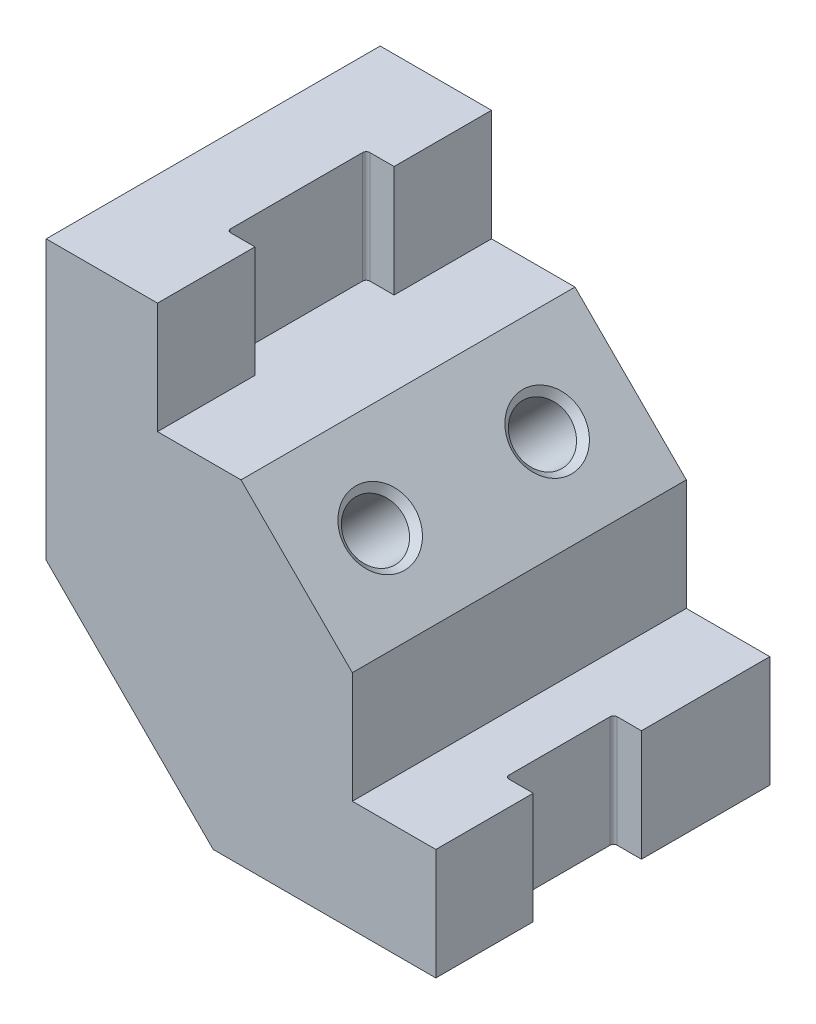
ISO-10303-21;
HEADER;
FILE_DESCRIPTION(('STEP AP214'),'2;1');
FILE_NAME('part.step','',(''),(''),'','','');
FILE_SCHEMA(('AUTOMOTIVE_DESIGN { 1 0 10303 214 1 1 1 1 }'));
ENDSEC;
DATA;
#1=APPLICATION_CONTEXT('core data for automotive mechanical design processes');
#2=APPLICATION_PROTOCOL_DEFINITION('international standard','automotive_design',2000,#1);
#3=PRODUCT_CONTEXT('',#1,'mechanical');
#4=PRODUCT('Part','Part','',(#3));
#5=PRODUCT_RELATED_PRODUCT_CATEGORY('part','',(#4));
#6=PRODUCT_DEFINITION_FORMATION('','',#4);
#7=PRODUCT_DEFINITION_CONTEXT('part definition',#1,'design');
#8=PRODUCT_DEFINITION('design','',#6,#7);
#9=PRODUCT_DEFINITION_SHAPE('','',#8);
#10=(LENGTH_UNIT() NAMED_UNIT(*) SI_UNIT(.MILLI.,.METRE.));
#11=(NAMED_UNIT(*) PLANE_ANGLE_UNIT() SI_UNIT($,.RADIAN.));
#12=(NAMED_UNIT(*) SI_UNIT($,.STERADIAN.) SOLID_ANGLE_UNIT());
#13=UNCERTAINTY_MEASURE_WITH_UNIT(LENGTH_MEASURE(1.E-05),#10,'distance_accuracy_value','');
#14=(GEOMETRIC_REPRESENTATION_CONTEXT(3) GLOBAL_UNCERTAINTY_ASSIGNED_CONTEXT((#13)) GLOBAL_UNIT_ASSIGNED_CONTEXT((#10,
#11,#12)) REPRESENTATION_CONTEXT('',''));
#15=CARTESIAN_POINT('',(0.,0.,0.));
#16=DIRECTION('',(0.,0.,1.));
#17=DIRECTION('',(1.,0.,0.));
#18=AXIS2_PLACEMENT_3D('',#15,#16,#17);
#19=CARTESIAN_POINT('',(88.9,-101.6,38.1));
#20=DIRECTION('',(-1.,0.,0.));
#21=DIRECTION('',(0.,0.,1.));
#22=AXIS2_PLACEMENT_3D('',#19,#20,#21);
#23=PLANE('',#22);
#24=DIRECTION('',(0.,0.,-1.));
#25=VECTOR('',#24,1.);
#26=CARTESIAN_POINT('',(88.9,-101.6,38.1));
#27=LINE('',#26,#25);
#28=CARTESIAN_POINT('',(88.9,-101.6,38.1));
#29=VERTEX_POINT('',#28);
#30=CARTESIAN_POINT('',(88.9,-101.6,15.875));
#31=VERTEX_POINT('',#30);
#32=EDGE_CURVE('E207',#29,#31,#27,.T.);
#33=ORIENTED_EDGE('',*,*,#32,.T.);
#34=DIRECTION('',(0.,1.,0.));
#35=VECTOR('',#34,1.);
#36=CARTESIAN_POINT('',(88.9,-101.6,15.875));
#37=LINE('',#36,#35);
#38=CARTESIAN_POINT('',(88.9,-76.2,15.875));
#39=VERTEX_POINT('',#38);
#40=EDGE_CURVE('E199',#31,#39,#37,.T.);
#41=ORIENTED_EDGE('',*,*,#40,.T.);
#42=DIRECTION('',(0.,0.,-1.));
#43=VECTOR('',#42,1.);
#44=CARTESIAN_POINT('',(88.9,-76.2,38.1));
#45=LINE('',#44,#43);
#46=CARTESIAN_POINT('',(88.9,-76.2,38.1));
#47=VERTEX_POINT('',#46);
#48=EDGE_CURVE('E208',#47,#39,#45,.T.);
#49=ORIENTED_EDGE('',*,*,#48,.F.);
#50=DIRECTION('',(0.,1.,0.));
#51=VECTOR('',#50,1.);
#52=CARTESIAN_POINT('',(88.9,-101.6,38.1));
#53=LINE('',#52,#51);
#54=EDGE_CURVE('E438',#29,#47,#53,.T.);
#55=ORIENTED_EDGE('',*,*,#54,.F.);
#56=EDGE_LOOP('',(#33,#41,#49,#55));
#57=FACE_BOUND('',#56,.T.);
#58=ADVANCED_FACE('F33',(#57),#23,.F.);
#59=CARTESIAN_POINT('',(25.4,-25.4,38.1));
#60=DIRECTION('',(-1.,0.,0.));
#61=DIRECTION('',(0.,0.,1.));
#62=AXIS2_PLACEMENT_3D('',#59,#60,#61);
#63=PLANE('',#62);
#64=DIRECTION('',(0.,0.,-1.));
#65=VECTOR('',#64,1.);
#66=CARTESIAN_POINT('',(25.4,-25.4,38.1));
#67=LINE('',#66,#65);
#68=CARTESIAN_POINT('',(25.4,-25.4,38.1));
#69=VERTEX_POINT('',#68);
#70=CARTESIAN_POINT('',(25.4,-25.4,15.875));
#71=VERTEX_POINT('',#70);
#72=EDGE_CURVE('E388',#69,#71,#67,.T.);
#73=ORIENTED_EDGE('',*,*,#72,.T.);
#74=DIRECTION('',(0.,1.,0.));
#75=VECTOR('',#74,1.);
#76=CARTESIAN_POINT('',(25.4,-25.4,15.875));
#77=LINE('',#76,#75);
#78=CARTESIAN_POINT('',(25.4,0.,15.875));
#79=VERTEX_POINT('',#78);
#80=EDGE_CURVE('E421',#71,#79,#77,.T.);
#81=ORIENTED_EDGE('',*,*,#80,.T.);
#82=DIRECTION('',(0.,0.,-1.));
#83=VECTOR('',#82,1.);
#84=CARTESIAN_POINT('',(25.4,0.,38.1));
#85=LINE('',#84,#83);
#86=CARTESIAN_POINT('',(25.4,0.,38.1));
#87=VERTEX_POINT('',#86);
#88=EDGE_CURVE('E384',#87,#79,#85,.T.);
#89=ORIENTED_EDGE('',*,*,#88,.F.);
#90=DIRECTION('',(0.,1.,0.));
#91=VECTOR('',#90,1.);
#92=CARTESIAN_POINT('',(25.4,-25.4,38.1));
#93=LINE('',#92,#91);
#94=EDGE_CURVE('E414',#69,#87,#93,.T.);
#95=ORIENTED_EDGE('',*,*,#94,.F.);
#96=EDGE_LOOP('',(#73,#81,#89,#95));
#97=FACE_BOUND('',#96,.T.);
#98=ADVANCED_FACE('F287',(#97),#63,.F.);
#99=CARTESIAN_POINT('',(0.,0.,38.1));
#100=DIRECTION('',(1.,0.,0.));
#101=DIRECTION('',(0.,1.,0.));
#102=AXIS2_PLACEMENT_3D('',#99,#100,#101);
#103=PLANE('',#102);
#104=DIRECTION('',(0.,-1.,0.));
#105=VECTOR('',#104,1.);
#106=CARTESIAN_POINT('',(0.,0.,-38.1));
#107=LINE('',#106,#105);
#108=CARTESIAN_POINT('',(0.,0.,-38.1));
#109=VERTEX_POINT('',#108);
#110=CARTESIAN_POINT('',(0.,-63.4999999999999,-38.1));
#111=VERTEX_POINT('',#110);
#112=EDGE_CURVE('E353',#109,#111,#107,.T.);
#113=ORIENTED_EDGE('',*,*,#112,.T.);
#114=DIRECTION('',(0.,0.,-1.));
#115=VECTOR('',#114,1.);
#116=CARTESIAN_POINT('',(0.,-63.4999999999999,38.1));
#117=LINE('',#116,#115);
#118=CARTESIAN_POINT('',(0.,-63.4999999999999,38.1));
#119=VERTEX_POINT('',#118);
#120=EDGE_CURVE('E217',#119,#111,#117,.T.);
#121=ORIENTED_EDGE('',*,*,#120,.F.);
#122=DIRECTION('',(0.,-1.,0.));
#123=VECTOR('',#122,1.);
#124=CARTESIAN_POINT('',(0.,0.,38.1));
#125=LINE('',#124,#123);
#126=CARTESIAN_POINT('',(0.,0.,38.1));
#127=VERTEX_POINT('',#126);
#128=EDGE_CURVE('E378',#127,#119,#125,.T.);
#129=ORIENTED_EDGE('',*,*,#128,.F.);
#130=DIRECTION('',(0.,0.,-1.));
#131=VECTOR('',#130,1.);
#132=CARTESIAN_POINT('',(0.,0.,38.1));
#133=LINE('',#132,#131);
#134=EDGE_CURVE('E379',#127,#109,#133,.T.);
#135=ORIENTED_EDGE('',*,*,#134,.T.);
#136=EDGE_LOOP('',(#113,#121,#129,#135));
#137=FACE_BOUND('',#136,.T.);
#138=ADVANCED_FACE('F293',(#137),#103,.F.);
#139=CARTESIAN_POINT('',(38.1,-101.6,38.1));
#140=DIRECTION('',(0.707106781186548,0.707106781186546,0.));
#141=DIRECTION('',(-0.707106781186547,0.707106781186549,0.));
#142=AXIS2_PLACEMENT_3D('',#139,#140,#141);
#143=PLANE('',#142);
#144=CARTESIAN_POINT('',(15.8769178448081,-79.376917844808,-19.05));
#145=DIRECTION('',(0.707106781186548,0.707106781186546,0.));
#146=DIRECTION('',(-0.707106781186547,0.707106781186549,0.));
#147=AXIS2_PLACEMENT_3D('',#144,#145,#146);
#148=CIRCLE('',#147,7.87400000000004);
#149=CARTESIAN_POINT('',(10.3091590497452,-73.8091590497451,-19.05));
#150=VERTEX_POINT('',#149);
#151=EDGE_CURVE('E257',#150,#150,#148,.T.);
#152=ORIENTED_EDGE('',*,*,#151,.T.);
#153=EDGE_LOOP('',(#152));
#154=FACE_BOUND('',#153,.T.);
#155=CARTESIAN_POINT('',(15.8769178448081,-79.376917844808,19.05));
#156=DIRECTION('',(0.707106781186548,0.707106781186546,0.));
#157=DIRECTION('',(-0.707106781186547,0.707106781186549,0.));
#158=AXIS2_PLACEMENT_3D('',#155,#156,#157);
#159=CIRCLE('',#158,7.87399999999998);
#160=CARTESIAN_POINT('',(10.3091590497453,-73.8091590497452,19.05));
#161=VERTEX_POINT('',#160);
#162=EDGE_CURVE('E254',#161,#161,#159,.T.);
#163=ORIENTED_EDGE('',*,*,#162,.T.);
#164=EDGE_LOOP('',(#163));
#165=FACE_BOUND('',#164,.T.);
#166=DIRECTION('',(0.707106781186546,-0.707106781186548,0.));
#167=VECTOR('',#166,1.);
#168=CARTESIAN_POINT('',(38.1,-101.6,-38.1));
#169=LINE('',#168,#167);
#170=CARTESIAN_POINT('',(38.1,-101.6,-38.1));
#171=VERTEX_POINT('',#170);
#172=EDGE_CURVE('E347',#111,#171,#169,.T.);
#173=ORIENTED_EDGE('',*,*,#172,.T.);
#174=DIRECTION('',(0.,0.,-1.));
#175=VECTOR('',#174,1.);
#176=CARTESIAN_POINT('',(38.1,-101.6,38.1));
#177=LINE('',#176,#175);
#178=CARTESIAN_POINT('',(38.1,-101.6,38.1));
#179=VERTEX_POINT('',#178);
#180=EDGE_CURVE('E211',#179,#171,#177,.T.);
#181=ORIENTED_EDGE('',*,*,#180,.F.);
#182=DIRECTION('',(0.707106781186546,-0.707106781186548,0.));
#183=VECTOR('',#182,1.);
#184=CARTESIAN_POINT('',(38.1,-101.6,38.1));
#185=LINE('',#184,#183);
#186=EDGE_CURVE('E435',#119,#179,#185,.T.);
#187=ORIENTED_EDGE('',*,*,#186,.F.);
#188=ORIENTED_EDGE('',*,*,#120,.T.);
#189=EDGE_LOOP('',(#173,#181,#187,#188));
#190=FACE_BOUND('',#189,.T.);
#191=ADVANCED_FACE('F307',(#154,#165,#190),#143,.F.);
#192=CARTESIAN_POINT('',(88.9,-101.6,38.1));
#193=DIRECTION('',(0.,1.,0.));
#194=DIRECTION('',(-1.,0.,0.));
#195=AXIS2_PLACEMENT_3D('',#192,#193,#194);
#196=PLANE('',#195);
#197=DIRECTION('',(-1.,0.,0.));
#198=VECTOR('',#197,1.);
#199=CARTESIAN_POINT('',(88.9,-101.6,-8.80841828335953));
#200=LINE('',#199,#198);
#201=CARTESIAN_POINT('',(88.9,-101.6,-8.80841828335953));
#202=VERTEX_POINT('',#201);
#203=CARTESIAN_POINT('',(83.3628,-101.6,-8.80841828335954));
#204=VERTEX_POINT('',#203);
#205=EDGE_CURVE('E181',#202,#204,#200,.T.);
#206=ORIENTED_EDGE('',*,*,#205,.T.);
#207=CARTESIAN_POINT('',(83.3628,-101.6,-7.99561828335954));
#208=DIRECTION('',(0.,1.,0.));
#209=DIRECTION('',(-1.,0.,0.));
#210=AXIS2_PLACEMENT_3D('',#207,#208,#209);
#211=CIRCLE('',#210,0.8128);
#212=CARTESIAN_POINT('',(82.55,-101.6,-7.99561828335954));
#213=VERTEX_POINT('',#212);
#214=EDGE_CURVE('E251',#204,#213,#211,.T.);
#215=ORIENTED_EDGE('',*,*,#214,.T.);
#216=DIRECTION('',(0.,0.,1.));
#217=VECTOR('',#216,1.);
#218=CARTESIAN_POINT('',(82.55,-101.6,15.875));
#219=LINE('',#218,#217);
#220=CARTESIAN_POINT('',(82.55,-101.6,15.0622));
#221=VERTEX_POINT('',#220);
#222=EDGE_CURVE('E189',#213,#221,#219,.T.);
#223=ORIENTED_EDGE('',*,*,#222,.T.);
#224=CARTESIAN_POINT('',(83.3628,-101.6,15.0622));
#225=DIRECTION('',(0.,1.,0.));
#226=DIRECTION('',(-1.,0.,0.));
#227=AXIS2_PLACEMENT_3D('',#224,#225,#226);
#228=CIRCLE('',#227,0.8128);
#229=CARTESIAN_POINT('',(83.3628,-101.6,15.875));
#230=VERTEX_POINT('',#229);
#231=EDGE_CURVE('E245',#221,#230,#228,.T.);
#232=ORIENTED_EDGE('',*,*,#231,.T.);
#233=DIRECTION('',(1.,0.,0.));
#234=VECTOR('',#233,1.);
#235=CARTESIAN_POINT('',(88.9,-101.6,15.875));
#236=LINE('',#235,#234);
#237=EDGE_CURVE('E200',#230,#31,#236,.T.);
#238=ORIENTED_EDGE('',*,*,#237,.T.);
#239=ORIENTED_EDGE('',*,*,#32,.F.);
#240=DIRECTION('',(1.,0.,0.));
#241=VECTOR('',#240,1.);
#242=CARTESIAN_POINT('',(88.9,-101.6,38.1));
#243=LINE('',#242,#241);
#244=EDGE_CURVE('E356',#179,#29,#243,.T.);
#245=ORIENTED_EDGE('',*,*,#244,.F.);
#246=ORIENTED_EDGE('',*,*,#180,.T.);
#247=DIRECTION('',(1.,0.,0.));
#248=VECTOR('',#247,1.);
#249=CARTESIAN_POINT('',(88.9,-101.6,-38.1));
#250=LINE('',#249,#248);
#251=CARTESIAN_POINT('',(88.9,-101.6,-38.1));
#252=VERTEX_POINT('',#251);
#253=EDGE_CURVE('E205',#171,#252,#250,.T.);
#254=ORIENTED_EDGE('',*,*,#253,.T.);
#255=EDGE_CURVE('E196',#202,#252,#27,.T.);
#256=ORIENTED_EDGE('',*,*,#255,.F.);
#257=EDGE_LOOP('',(#206,#215,#223,#232,#238,#239,#245,#246,#254,#256));
#258=FACE_BOUND('',#257,.T.);
#259=ADVANCED_FACE('F202',(#258),#196,.F.);
#260=CARTESIAN_POINT('',(88.9,-76.2,-8.80841828335952));
#261=VERTEX_POINT('',#260);
#262=CARTESIAN_POINT('',(88.9,-76.2,-38.1));
#263=VERTEX_POINT('',#262);
#264=EDGE_CURVE('E198',#261,#263,#45,.T.);
#265=ORIENTED_EDGE('',*,*,#264,.F.);
#266=DIRECTION('',(0.,1.,0.));
#267=VECTOR('',#266,1.);
#268=CARTESIAN_POINT('',(88.9,-101.6,-8.80841828335953));
#269=LINE('',#268,#267);
#270=EDGE_CURVE('E184',#202,#261,#269,.T.);
#271=ORIENTED_EDGE('',*,*,#270,.F.);
#272=ORIENTED_EDGE('',*,*,#255,.T.);
#273=DIRECTION('',(0.,1.,0.));
#274=VECTOR('',#273,1.);
#275=CARTESIAN_POINT('',(88.9,-101.6,-38.1));
#276=LINE('',#275,#274);
#277=EDGE_CURVE('E359',#252,#263,#276,.T.);
#278=ORIENTED_EDGE('',*,*,#277,.T.);
#279=EDGE_LOOP('',(#265,#271,#272,#278));
#280=FACE_BOUND('',#279,.T.);
#281=ADVANCED_FACE('F194',(#280),#23,.F.);
#282=CARTESIAN_POINT('',(88.9,-76.2,38.1));
#283=DIRECTION('',(0.,-1.,0.));
#284=DIRECTION('',(1.,0.,0.));
#285=AXIS2_PLACEMENT_3D('',#282,#283,#284);
#286=PLANE('',#285);
#287=ORIENTED_EDGE('',*,*,#48,.T.);
#288=DIRECTION('',(1.,0.,0.));
#289=VECTOR('',#288,1.);
#290=CARTESIAN_POINT('',(88.9,-76.2,15.875));
#291=LINE('',#290,#289);
#292=CARTESIAN_POINT('',(83.3628,-76.2,15.875));
#293=VERTEX_POINT('',#292);
#294=EDGE_CURVE('E190',#293,#39,#291,.T.);
#295=ORIENTED_EDGE('',*,*,#294,.F.);
#296=CARTESIAN_POINT('',(83.3628,-76.2,15.0622));
#297=DIRECTION('',(0.,-1.,0.));
#298=DIRECTION('',(1.,0.,0.));
#299=AXIS2_PLACEMENT_3D('',#296,#297,#298);
#300=CIRCLE('',#299,0.8128);
#301=CARTESIAN_POINT('',(82.55,-76.2,15.0622));
#302=VERTEX_POINT('',#301);
#303=EDGE_CURVE('E243',#293,#302,#300,.T.);
#304=ORIENTED_EDGE('',*,*,#303,.T.);
#305=DIRECTION('',(0.,0.,1.));
#306=VECTOR('',#305,1.);
#307=CARTESIAN_POINT('',(82.55,-76.2,15.875));
#308=LINE('',#307,#306);
#309=CARTESIAN_POINT('',(82.55,-76.2,-7.99561828335954));
#310=VERTEX_POINT('',#309);
#311=EDGE_CURVE('E497',#310,#302,#308,.T.);
#312=ORIENTED_EDGE('',*,*,#311,.F.);
#313=CARTESIAN_POINT('',(83.3628,-76.2,-7.99561828335954));
#314=DIRECTION('',(0.,-1.,0.));
#315=DIRECTION('',(1.,0.,0.));
#316=AXIS2_PLACEMENT_3D('',#313,#314,#315);
#317=CIRCLE('',#316,0.8128);
#318=CARTESIAN_POINT('',(83.3628,-76.2,-8.80841828335954));
#319=VERTEX_POINT('',#318);
#320=EDGE_CURVE('E249',#310,#319,#317,.T.);
#321=ORIENTED_EDGE('',*,*,#320,.T.);
#322=DIRECTION('',(-1.,0.,0.));
#323=VECTOR('',#322,1.);
#324=CARTESIAN_POINT('',(88.9,-76.2,-8.80841828335953));
#325=LINE('',#324,#323);
#326=EDGE_CURVE('E402',#261,#319,#325,.T.);
#327=ORIENTED_EDGE('',*,*,#326,.F.);
#328=ORIENTED_EDGE('',*,*,#264,.T.);
#329=DIRECTION('',(-1.,0.,0.));
#330=VECTOR('',#329,1.);
#331=CARTESIAN_POINT('',(88.9,-76.2,-38.1));
#332=LINE('',#331,#330);
#333=CARTESIAN_POINT('',(69.8499999999999,-76.2,-38.1));
#334=VERTEX_POINT('',#333);
#335=EDGE_CURVE('E361',#263,#334,#332,.T.);
#336=ORIENTED_EDGE('',*,*,#335,.T.);
#337=DIRECTION('',(0.,0.,-1.));
#338=VECTOR('',#337,1.);
#339=CARTESIAN_POINT('',(69.8499999999999,-76.2,38.1));
#340=LINE('',#339,#338);
#341=CARTESIAN_POINT('',(69.8499999999999,-76.2,38.1));
#342=VERTEX_POINT('',#341);
#343=EDGE_CURVE('E396',#342,#334,#340,.T.);
#344=ORIENTED_EDGE('',*,*,#343,.F.);
#345=DIRECTION('',(-1.,0.,0.));
#346=VECTOR('',#345,1.);
#347=CARTESIAN_POINT('',(88.9,-76.2,38.1));
#348=LINE('',#347,#346);
#349=EDGE_CURVE('E416',#47,#342,#348,.T.);
#350=ORIENTED_EDGE('',*,*,#349,.F.);
#351=EDGE_LOOP('',(#287,#295,#304,#312,#321,#327,#328,#336,#344,#350));
#352=FACE_BOUND('',#351,.T.);
#353=ADVANCED_FACE('F300',(#352),#286,.F.);
#354=CARTESIAN_POINT('',(69.8499999999999,-76.2,38.1));
#355=DIRECTION('',(-1.,0.,0.));
#356=DIRECTION('',(0.,0.,1.));
#357=AXIS2_PLACEMENT_3D('',#354,#355,#356);
#358=PLANE('',#357);
#359=DIRECTION('',(0.,1.,0.));
#360=VECTOR('',#359,1.);
#361=CARTESIAN_POINT('',(69.8499999999999,-76.2,-38.1));
#362=LINE('',#361,#360);
#363=CARTESIAN_POINT('',(69.8499999999999,-50.8,-38.1));
#364=VERTEX_POINT('',#363);
#365=EDGE_CURVE('E366',#334,#364,#362,.T.);
#366=ORIENTED_EDGE('',*,*,#365,.T.);
#367=DIRECTION('',(0.,0.,-1.));
#368=VECTOR('',#367,1.);
#369=CARTESIAN_POINT('',(69.8499999999999,-50.8,38.1));
#370=LINE('',#369,#368);
#371=CARTESIAN_POINT('',(69.8499999999999,-50.8,38.1));
#372=VERTEX_POINT('',#371);
#373=EDGE_CURVE('E394',#372,#364,#370,.T.);
#374=ORIENTED_EDGE('',*,*,#373,.F.);
#375=DIRECTION('',(0.,1.,0.));
#376=VECTOR('',#375,1.);
#377=CARTESIAN_POINT('',(69.8499999999999,-76.2,38.1));
#378=LINE('',#377,#376);
#379=EDGE_CURVE('E412',#342,#372,#378,.T.);
#380=ORIENTED_EDGE('',*,*,#379,.F.);
#381=ORIENTED_EDGE('',*,*,#343,.T.);
#382=EDGE_LOOP('',(#366,#374,#380,#381));
#383=FACE_BOUND('',#382,.T.);
#384=ADVANCED_FACE('F305',(#383),#358,.F.);
#385=CARTESIAN_POINT('',(69.8499999999999,-50.8,38.1));
#386=DIRECTION('',(-0.707106781186548,-0.707106781186547,0.));
#387=DIRECTION('',(0.707106781186547,-0.707106781186548,0.));
#388=AXIS2_PLACEMENT_3D('',#385,#386,#387);
#389=PLANE('',#388);
#390=CARTESIAN_POINT('',(57.1519178448081,-38.1019178448082,-19.05));
#391=DIRECTION('',(-0.707106781186548,-0.707106781186547,0.));
#392=DIRECTION('',(0.707106781186547,-0.707106781186548,0.));
#393=AXIS2_PLACEMENT_3D('',#390,#391,#392);
#394=CIRCLE('',#393,7.87399999999999);
#395=CARTESIAN_POINT('',(62.719676639871,-43.669676639871,-19.05));
#396=VERTEX_POINT('',#395);
#397=EDGE_CURVE('E11',#396,#396,#394,.T.);
#398=ORIENTED_EDGE('',*,*,#397,.T.);
#399=EDGE_LOOP('',(#398));
#400=FACE_BOUND('',#399,.T.);
#401=CARTESIAN_POINT('',(57.1519178448081,-38.1019178448082,19.05));
#402=DIRECTION('',(-0.707106781186548,-0.707106781186547,0.));
#403=DIRECTION('',(0.707106781186547,-0.707106781186548,0.));
#404=AXIS2_PLACEMENT_3D('',#401,#402,#403);
#405=CIRCLE('',#404,7.87399999999997);
#406=CARTESIAN_POINT('',(62.719676639871,-43.669676639871,19.05));
#407=VERTEX_POINT('',#406);
#408=EDGE_CURVE('E41',#407,#407,#405,.T.);
#409=ORIENTED_EDGE('',*,*,#408,.T.);
#410=EDGE_LOOP('',(#409));
#411=FACE_BOUND('',#410,.T.);
#412=DIRECTION('',(-0.707106781186547,0.707106781186548,0.));
#413=VECTOR('',#412,1.);
#414=CARTESIAN_POINT('',(69.8499999999999,-50.8,-38.1));
#415=LINE('',#414,#413);
#416=CARTESIAN_POINT('',(44.45,-25.4,-38.1));
#417=VERTEX_POINT('',#416);
#418=EDGE_CURVE('E368',#364,#417,#415,.T.);
#419=ORIENTED_EDGE('',*,*,#418,.T.);
#420=DIRECTION('',(0.,0.,-1.));
#421=VECTOR('',#420,1.);
#422=CARTESIAN_POINT('',(44.45,-25.4,38.1));
#423=LINE('',#422,#421);
#424=CARTESIAN_POINT('',(44.45,-25.4,38.1));
#425=VERTEX_POINT('',#424);
#426=EDGE_CURVE('E391',#425,#417,#423,.T.);
#427=ORIENTED_EDGE('',*,*,#426,.F.);
#428=DIRECTION('',(-0.707106781186547,0.707106781186548,0.));
#429=VECTOR('',#428,1.);
#430=CARTESIAN_POINT('',(69.8499999999999,-50.8,38.1));
#431=LINE('',#430,#429);
#432=EDGE_CURVE('E408',#372,#425,#431,.T.);
#433=ORIENTED_EDGE('',*,*,#432,.F.);
#434=ORIENTED_EDGE('',*,*,#373,.T.);
#435=EDGE_LOOP('',(#419,#427,#433,#434));
#436=FACE_BOUND('',#435,.T.);
#437=ADVANCED_FACE('F274',(#400,#411,#436),#389,.F.);
#438=CARTESIAN_POINT('',(44.45,-25.4,38.1));
#439=DIRECTION('',(0.,-1.,0.));
#440=DIRECTION('',(1.,0.,0.));
#441=AXIS2_PLACEMENT_3D('',#438,#439,#440);
#442=PLANE('',#441);
#443=DIRECTION('',(0.,0.,1.));
#444=VECTOR('',#443,1.);
#445=CARTESIAN_POINT('',(19.05,-25.4,15.875));
#446=LINE('',#445,#444);
#447=CARTESIAN_POINT('',(19.05,-25.4,-15.0622));
#448=VERTEX_POINT('',#447);
#449=CARTESIAN_POINT('',(19.05,-25.4,15.0622));
#450=VERTEX_POINT('',#449);
#451=EDGE_CURVE('E458',#448,#450,#446,.T.);
#452=ORIENTED_EDGE('',*,*,#451,.T.);
#453=CARTESIAN_POINT('',(19.8628,-25.4,15.0622));
#454=DIRECTION('',(0.,-1.,0.));
#455=DIRECTION('',(1.,0.,0.));
#456=AXIS2_PLACEMENT_3D('',#453,#454,#455);
#457=CIRCLE('',#456,0.8128);
#458=CARTESIAN_POINT('',(19.8628,-25.4,15.875));
#459=VERTEX_POINT('',#458);
#460=EDGE_CURVE('E238',#450,#459,#457,.F.);
#461=ORIENTED_EDGE('',*,*,#460,.T.);
#462=DIRECTION('',(1.,0.,0.));
#463=VECTOR('',#462,1.);
#464=CARTESIAN_POINT('',(25.4,-25.4,15.875));
#465=LINE('',#464,#463);
#466=EDGE_CURVE('E427',#459,#71,#465,.T.);
#467=ORIENTED_EDGE('',*,*,#466,.T.);
#468=ORIENTED_EDGE('',*,*,#72,.F.);
#469=DIRECTION('',(-1.,0.,0.));
#470=VECTOR('',#469,1.);
#471=CARTESIAN_POINT('',(44.45,-25.4,38.1));
#472=LINE('',#471,#470);
#473=EDGE_CURVE('E411',#425,#69,#472,.T.);
#474=ORIENTED_EDGE('',*,*,#473,.F.);
#475=ORIENTED_EDGE('',*,*,#426,.T.);
#476=DIRECTION('',(-1.,0.,0.));
#477=VECTOR('',#476,1.);
#478=CARTESIAN_POINT('',(44.45,-25.4,-38.1));
#479=LINE('',#478,#477);
#480=CARTESIAN_POINT('',(25.4,-25.4,-38.1));
#481=VERTEX_POINT('',#480);
#482=EDGE_CURVE('E370',#417,#481,#479,.T.);
#483=ORIENTED_EDGE('',*,*,#482,.T.);
#484=CARTESIAN_POINT('',(25.4,-25.4,-15.875));
#485=VERTEX_POINT('',#484);
#486=EDGE_CURVE('E387',#485,#481,#67,.T.);
#487=ORIENTED_EDGE('',*,*,#486,.F.);
#488=DIRECTION('',(-1.,0.,0.));
#489=VECTOR('',#488,1.);
#490=CARTESIAN_POINT('',(25.4,-25.4,-15.875));
#491=LINE('',#490,#489);
#492=CARTESIAN_POINT('',(19.8628,-25.4,-15.875));
#493=VERTEX_POINT('',#492);
#494=EDGE_CURVE('E455',#485,#493,#491,.T.);
#495=ORIENTED_EDGE('',*,*,#494,.T.);
#496=CARTESIAN_POINT('',(19.8628,-25.4,-15.0622));
#497=DIRECTION('',(0.,-1.,0.));
#498=DIRECTION('',(1.,0.,0.));
#499=AXIS2_PLACEMENT_3D('',#496,#497,#498);
#500=CIRCLE('',#499,0.8128);
#501=EDGE_CURVE('E236',#493,#448,#500,.F.);
#502=ORIENTED_EDGE('',*,*,#501,.T.);
#503=EDGE_LOOP('',(#452,#461,#467,#468,#474,#475,#483,#487,#495,#502));
#504=FACE_BOUND('',#503,.T.);
#505=ADVANCED_FACE('F475',(#504),#442,.F.);
#506=CARTESIAN_POINT('',(25.4,0.,-15.875));
#507=VERTEX_POINT('',#506);
#508=CARTESIAN_POINT('',(25.4,0.,-38.1));
#509=VERTEX_POINT('',#508);
#510=EDGE_CURVE('E382',#507,#509,#85,.T.);
#511=ORIENTED_EDGE('',*,*,#510,.F.);
#512=DIRECTION('',(0.,1.,0.));
#513=VECTOR('',#512,1.);
#514=CARTESIAN_POINT('',(25.4,-25.4,-15.875));
#515=LINE('',#514,#513);
#516=EDGE_CURVE('E423',#485,#507,#515,.T.);
#517=ORIENTED_EDGE('',*,*,#516,.F.);
#518=ORIENTED_EDGE('',*,*,#486,.T.);
#519=DIRECTION('',(0.,1.,0.));
#520=VECTOR('',#519,1.);
#521=CARTESIAN_POINT('',(25.4,-25.4,-38.1));
#522=LINE('',#521,#520);
#523=EDGE_CURVE('E373',#481,#509,#522,.T.);
#524=ORIENTED_EDGE('',*,*,#523,.T.);
#525=EDGE_LOOP('',(#511,#517,#518,#524));
#526=FACE_BOUND('',#525,.T.);
#527=ADVANCED_FACE('F296',(#526),#63,.F.);
#528=CARTESIAN_POINT('',(25.4,0.,38.1));
#529=DIRECTION('',(0.,-1.,0.));
#530=DIRECTION('',(0.,0.,-1.));
#531=AXIS2_PLACEMENT_3D('',#528,#529,#530);
#532=PLANE('',#531);
#533=ORIENTED_EDGE('',*,*,#88,.T.);
#534=DIRECTION('',(1.,0.,0.));
#535=VECTOR('',#534,1.);
#536=CARTESIAN_POINT('',(25.4,0.,15.875));
#537=LINE('',#536,#535);
#538=CARTESIAN_POINT('',(19.8628,0.,15.875));
#539=VERTEX_POINT('',#538);
#540=EDGE_CURVE('E430',#539,#79,#537,.T.);
#541=ORIENTED_EDGE('',*,*,#540,.F.);
#542=CARTESIAN_POINT('',(19.8628,0.,15.0622));
#543=DIRECTION('',(0.,-1.,0.));
#544=DIRECTION('',(0.,0.,-1.));
#545=AXIS2_PLACEMENT_3D('',#542,#543,#544);
#546=CIRCLE('',#545,0.8128);
#547=CARTESIAN_POINT('',(19.05,0.,15.0622));
#548=VERTEX_POINT('',#547);
#549=EDGE_CURVE('E247',#539,#548,#546,.T.);
#550=ORIENTED_EDGE('',*,*,#549,.T.);
#551=DIRECTION('',(0.,0.,1.));
#552=VECTOR('',#551,1.);
#553=CARTESIAN_POINT('',(19.05,0.,15.875));
#554=LINE('',#553,#552);
#555=CARTESIAN_POINT('',(19.05,0.,-15.0622));
#556=VERTEX_POINT('',#555);
#557=EDGE_CURVE('E450',#556,#548,#554,.T.);
#558=ORIENTED_EDGE('',*,*,#557,.F.);
#559=CARTESIAN_POINT('',(19.8628,0.,-15.0622));
#560=DIRECTION('',(0.,-1.,0.));
#561=DIRECTION('',(0.,0.,-1.));
#562=AXIS2_PLACEMENT_3D('',#559,#560,#561);
#563=CIRCLE('',#562,0.8128);
#564=CARTESIAN_POINT('',(19.8628,0.,-15.875));
#565=VERTEX_POINT('',#564);
#566=EDGE_CURVE('E48',#556,#565,#563,.T.);
#567=ORIENTED_EDGE('',*,*,#566,.T.);
#568=DIRECTION('',(-1.,0.,0.));
#569=VECTOR('',#568,1.);
#570=CARTESIAN_POINT('',(25.4,0.,-15.875));
#571=LINE('',#570,#569);
#572=EDGE_CURVE('E448',#507,#565,#571,.T.);
#573=ORIENTED_EDGE('',*,*,#572,.F.);
#574=ORIENTED_EDGE('',*,*,#510,.T.);
#575=DIRECTION('',(-1.,0.,0.));
#576=VECTOR('',#575,1.);
#577=CARTESIAN_POINT('',(25.4,0.,-38.1));
#578=LINE('',#577,#576);
#579=EDGE_CURVE('E376',#509,#109,#578,.T.);
#580=ORIENTED_EDGE('',*,*,#579,.T.);
#581=ORIENTED_EDGE('',*,*,#134,.F.);
#582=DIRECTION('',(-1.,0.,0.));
#583=VECTOR('',#582,1.);
#584=CARTESIAN_POINT('',(25.4,0.,38.1));
#585=LINE('',#584,#583);
#586=EDGE_CURVE('E383',#87,#127,#585,.T.);
#587=ORIENTED_EDGE('',*,*,#586,.F.);
#588=EDGE_LOOP('',(#533,#541,#550,#558,#567,#573,#574,#580,#581,#587));
#589=FACE_BOUND('',#588,.T.);
#590=ADVANCED_FACE('F469',(#589),#532,.F.);
#591=CARTESIAN_POINT('',(0.,0.,38.1));
#592=DIRECTION('',(0.,0.,-1.));
#593=DIRECTION('',(-1.,0.,0.));
#594=AXIS2_PLACEMENT_3D('',#591,#592,#593);
#595=PLANE('',#594);
#596=ORIENTED_EDGE('',*,*,#128,.T.);
#597=ORIENTED_EDGE('',*,*,#186,.T.);
#598=ORIENTED_EDGE('',*,*,#244,.T.);
#599=ORIENTED_EDGE('',*,*,#54,.T.);
#600=ORIENTED_EDGE('',*,*,#349,.T.);
#601=ORIENTED_EDGE('',*,*,#379,.T.);
#602=ORIENTED_EDGE('',*,*,#432,.T.);
#603=ORIENTED_EDGE('',*,*,#473,.T.);
#604=ORIENTED_EDGE('',*,*,#94,.T.);
#605=ORIENTED_EDGE('',*,*,#586,.T.);
#606=EDGE_LOOP('',(#596,#597,#598,#599,#600,#601,#602,#603,#604,#605));
#607=FACE_BOUND('',#606,.T.);
#608=ADVANCED_FACE('F440',(#607),#595,.F.);
#609=CARTESIAN_POINT('',(0.,0.,-38.1));
#610=DIRECTION('',(0.,0.,-1.));
#611=DIRECTION('',(-1.,0.,0.));
#612=AXIS2_PLACEMENT_3D('',#609,#610,#611);
#613=PLANE('',#612);
#614=ORIENTED_EDGE('',*,*,#112,.F.);
#615=ORIENTED_EDGE('',*,*,#579,.F.);
#616=ORIENTED_EDGE('',*,*,#523,.F.);
#617=ORIENTED_EDGE('',*,*,#482,.F.);
#618=ORIENTED_EDGE('',*,*,#418,.F.);
#619=ORIENTED_EDGE('',*,*,#365,.F.);
#620=ORIENTED_EDGE('',*,*,#335,.F.);
#621=ORIENTED_EDGE('',*,*,#277,.F.);
#622=ORIENTED_EDGE('',*,*,#253,.F.);
#623=ORIENTED_EDGE('',*,*,#172,.F.);
#624=EDGE_LOOP('',(#614,#615,#616,#617,#618,#619,#620,#621,#622,#623));
#625=FACE_BOUND('',#624,.T.);
#626=ADVANCED_FACE('F357',(#625),#613,.T.);
#627=CARTESIAN_POINT('',(-3.17308215519192,-98.4269178448081,19.05));
#628=DIRECTION('',(0.707106781186548,0.707106781186546,0.));
#629=DIRECTION('',(-0.707106781186547,0.707106781186549,0.));
#630=AXIS2_PLACEMENT_3D('',#627,#628,#629);
#631=CYLINDRICAL_SURFACE('',#630,6.35);
#632=CARTESIAN_POINT('',(16.9545485793364,-78.2992871102798,19.05));
#633=DIRECTION('',(0.707106781186549,0.707106781186546,0.));
#634=DIRECTION('',(-0.707106781186546,0.707106781186549,0.));
#635=AXIS2_PLACEMENT_3D('',#632,#633,#634);
#636=CIRCLE('',#635,6.35);
#637=CARTESIAN_POINT('',(12.4644205188019,-73.8091590497452,19.05));
#638=VERTEX_POINT('',#637);
#639=EDGE_CURVE('E269',#638,#638,#636,.F.);
#640=ORIENTED_EDGE('',*,*,#639,.T.);
#641=EDGE_LOOP('',(#640));
#642=FACE_BOUND('',#641,.T.);
#643=CARTESIAN_POINT('',(56.0742871102799,-39.1795485793364,19.05));
#644=DIRECTION('',(-0.70710678118655,-0.707106781186545,0.));
#645=DIRECTION('',(0.707106781186545,-0.70710678118655,0.));
#646=AXIS2_PLACEMENT_3D('',#643,#644,#645);
#647=CIRCLE('',#646,6.35);
#648=CARTESIAN_POINT('',(60.5644151708144,-43.669676639871,19.05));
#649=VERTEX_POINT('',#648);
#650=EDGE_CURVE('E266',#649,#649,#647,.F.);
#651=ORIENTED_EDGE('',*,*,#650,.T.);
#652=EDGE_LOOP('',(#651));
#653=FACE_BOUND('',#652,.T.);
#654=ADVANCED_FACE('F524',(#642,#653),#631,.F.);
#655=CARTESIAN_POINT('',(-3.17308215519192,-98.4269178448081,-19.05));
#656=DIRECTION('',(0.707106781186548,0.707106781186546,0.));
#657=DIRECTION('',(-0.707106781186547,0.707106781186549,0.));
#658=AXIS2_PLACEMENT_3D('',#655,#656,#657);
#659=CYLINDRICAL_SURFACE('',#658,6.35);
#660=CARTESIAN_POINT('',(16.9545485793364,-78.2992871102798,-19.05));
#661=DIRECTION('',(0.707106781186553,0.707106781186542,0.));
#662=DIRECTION('',(-0.707106781186542,0.707106781186553,0.));
#663=AXIS2_PLACEMENT_3D('',#660,#661,#662);
#664=CIRCLE('',#663,6.35);
#665=CARTESIAN_POINT('',(12.4644205188019,-73.8091590497452,-19.05));
#666=VERTEX_POINT('',#665);
#667=EDGE_CURVE('E263',#666,#666,#664,.F.);
#668=CARTESIAN_POINT('',(56.0742871102799,-39.1795485793365,-19.05));
#669=DIRECTION('',(-0.70710678118655,-0.707106781186545,0.));
#670=DIRECTION('',(0.707106781186545,-0.70710678118655,0.));
#671=AXIS2_PLACEMENT_3D('',#668,#669,#670);
#672=CIRCLE('',#671,6.35);
#673=CARTESIAN_POINT('',(51.5841590497453,-34.6894205188019,-19.05));
#674=VERTEX_POINT('',#673);
#675=EDGE_CURVE('E260',#674,#674,#672,.F.);
#676=CARTESIAN_POINT('',(12.4644205188019,-73.8091590497452,-19.05));
#677=CARTESIAN_POINT('',(12.8719177951659,-73.4016617733812,-19.05));
#678=CARTESIAN_POINT('',(13.2794150715299,-72.9941644970172,-19.05));
#679=CARTESIAN_POINT('',(14.0944096242579,-72.1791699442892,-19.05));
#680=CARTESIAN_POINT('',(14.5019069006219,-71.7716726679252,-19.05));
#681=CARTESIAN_POINT('',(15.3169014533498,-70.9566781151972,-19.05));
#682=CARTESIAN_POINT('',(15.7243987297138,-70.5491808388332,-19.05));
#683=CARTESIAN_POINT('',(16.5393932824418,-69.7341862861052,-19.05));
#684=CARTESIAN_POINT('',(16.9468905588058,-69.3266890097412,-19.05));
#685=CARTESIAN_POINT('',(17.7618851115338,-68.5116944570133,-19.05));
#686=CARTESIAN_POINT('',(18.1693823878978,-68.1041971806493,-19.05));
#687=CARTESIAN_POINT('',(18.9843769406258,-67.2892026279213,-19.05));
#688=CARTESIAN_POINT('',(19.3918742169898,-66.8817053515573,-19.05));
#689=CARTESIAN_POINT('',(20.2068687697178,-66.0667107988293,-19.05));
#690=CARTESIAN_POINT('',(20.6143660460818,-65.6592135224653,-19.05));
#691=CARTESIAN_POINT('',(21.4293605988098,-64.8442189697373,-19.05));
#692=CARTESIAN_POINT('',(21.8368578751737,-64.4367216933733,-19.05));
#693=CARTESIAN_POINT('',(22.6518524279017,-63.6217271406453,-19.05));
#694=CARTESIAN_POINT('',(23.0593497042657,-63.2142298642814,-19.05));
#695=CARTESIAN_POINT('',(23.8743442569937,-62.3992353115534,-19.05));
#696=CARTESIAN_POINT('',(24.2818415333577,-61.9917380351894,-19.05));
#697=CARTESIAN_POINT('',(25.0968360860857,-61.1767434824614,-19.05));
#698=CARTESIAN_POINT('',(25.5043333624497,-60.7692462060974,-19.05));
#699=CARTESIAN_POINT('',(26.3193279151777,-59.9542516533694,-19.05));
#700=CARTESIAN_POINT('',(26.7268251915417,-59.5467543770054,-19.05));
#701=CARTESIAN_POINT('',(27.5418197442697,-58.7317598242774,-19.05));
#702=CARTESIAN_POINT('',(27.9493170206337,-58.3242625479134,-19.05));
#703=CARTESIAN_POINT('',(28.7643115733616,-57.5092679951855,-19.05));
#704=CARTESIAN_POINT('',(29.1718088497256,-57.1017707188215,-19.05));
#705=CARTESIAN_POINT('',(29.9868034024536,-56.2867761660935,-19.05));
#706=CARTESIAN_POINT('',(30.3943006788176,-55.8792788897295,-19.05));
#707=CARTESIAN_POINT('',(31.2092952315456,-55.0642843370015,-19.05));
#708=CARTESIAN_POINT('',(31.6167925079096,-54.6567870606375,-19.05));
#709=CARTESIAN_POINT('',(32.4317870606376,-53.8417925079095,-19.05));
#710=CARTESIAN_POINT('',(32.8392843370016,-53.4342952315455,-19.05));
#711=CARTESIAN_POINT('',(33.6542788897296,-52.6193006788176,-19.05));
#712=CARTESIAN_POINT('',(34.0617761660936,-52.2118034024536,-19.05));
#713=CARTESIAN_POINT('',(34.8767707188215,-51.3968088497256,-19.05));
#714=CARTESIAN_POINT('',(35.2842679951855,-50.9893115733616,-19.05));
#715=CARTESIAN_POINT('',(36.0992625479135,-50.1743170206336,-19.05));
#716=CARTESIAN_POINT('',(36.5067598242775,-49.7668197442696,-19.05));
#717=CARTESIAN_POINT('',(37.3217543770055,-48.9518251915416,-19.05));
#718=CARTESIAN_POINT('',(37.7292516533695,-48.5443279151776,-19.05));
#719=CARTESIAN_POINT('',(38.5442462060975,-47.7293333624496,-19.05));
#720=CARTESIAN_POINT('',(38.9517434824615,-47.3218360860856,-19.05));
#721=CARTESIAN_POINT('',(39.7667380351895,-46.5068415333577,-19.05));
#722=CARTESIAN_POINT('',(40.1742353115535,-46.0993442569937,-19.05));
#723=CARTESIAN_POINT('',(40.9892298642815,-45.2843497042657,-19.05));
#724=CARTESIAN_POINT('',(41.3967271406454,-44.8768524279017,-19.05));
#725=CARTESIAN_POINT('',(42.2117216933734,-44.0618578751737,-19.05));
#726=CARTESIAN_POINT('',(42.6192189697374,-43.6543605988097,-19.05));
#727=CARTESIAN_POINT('',(43.4342135224654,-42.8393660460817,-19.05));
#728=CARTESIAN_POINT('',(43.8417107988294,-42.4318687697177,-19.05));
#729=CARTESIAN_POINT('',(44.6567053515574,-41.6168742169897,-19.05));
#730=CARTESIAN_POINT('',(45.0642026279214,-41.2093769406258,-19.05));
#731=CARTESIAN_POINT('',(45.8791971806494,-40.3943823878978,-19.05));
#732=CARTESIAN_POINT('',(46.2866944570134,-39.9868851115338,-19.05));
#733=CARTESIAN_POINT('',(47.1016890097413,-39.1718905588058,-19.05));
#734=CARTESIAN_POINT('',(47.5091862861053,-38.7643932824418,-19.05));
#735=CARTESIAN_POINT('',(48.3241808388333,-37.9493987297138,-19.05));
#736=CARTESIAN_POINT('',(48.7316781151973,-37.5419014533498,-19.05));
#737=CARTESIAN_POINT('',(49.5466726679253,-36.7269069006218,-19.05));
#738=CARTESIAN_POINT('',(49.9541699442893,-36.3194096242578,-19.05));
#739=CARTESIAN_POINT('',(50.7691644970173,-35.5044150715299,-19.05));
#740=CARTESIAN_POINT('',(51.1766617733813,-35.0969177951659,-19.05));
#741=CARTESIAN_POINT('',(51.5841590497453,-34.6894205188019,-19.05));
#742=B_SPLINE_CURVE_WITH_KNOTS('',3,(#676,#677,#678,#679,#680,#681,#682,#683,#684,#685,#686,
#687,#688,#689,#690,#691,#692,#693,#694,#695,#696,#697,#698,#699,#700,#701,#702,#703,#704,#705,
#706,#707,#708,#709,#710,#711,#712,#713,#714,#715,#716,#717,#718,#719,#720,#721,#722,#723,#724,
#725,#726,#727,#728,#729,#730,#731,#732,#733,#734,#735,#736,#737,#738,#739,#740,#741),
.UNSPECIFIED.,.F.,.F.,(4,2,2,2,2,2,2,2,2,2,2,2,2,2,2,2,2,2,2,2,2,2,2,2,2,2,2,2,2,2,2,2,4),(0.,
1.72886452459217,3.45772904918433,5.18659357377651,6.91545809836868,8.64432262296084,
10.373187147553,12.1020516721452,13.8309161967374,15.5597807213295,17.2886452459217,
19.0175097705139,20.746374295106,22.4752388196982,24.2041033442904,25.9329678688825,
27.6618323934747,29.3906969180669,31.119561442659,32.8484259672512,34.5772904918434,
36.3061550164356,38.0350195410277,39.7638840656199,41.4927485902121,43.2216131148042,
44.9504776393964,46.6793421639886,48.4082066885807,50.1370712131729,51.8659357377651,
53.5948002623572,55.3236647869494),.UNSPECIFIED.);
#743=EDGE_CURVE('BSEAM517',#666,#674,#742,.T.);
#744=ORIENTED_EDGE('',*,*,#667,.T.);
#745=ORIENTED_EDGE('',*,*,#675,.T.);
#746=ORIENTED_EDGE('',*,*,#743,.T.);
#747=ORIENTED_EDGE('',*,*,#743,.F.);
#748=EDGE_LOOP('',(#744,#746,#745,#747));
#749=FACE_BOUND('',#748,.T.);
#750=ADVANCED_FACE('F517',(#749),#659,.F.);
#751=CARTESIAN_POINT('',(25.4,-25.4,15.875));
#752=DIRECTION('',(0.,0.,1.));
#753=DIRECTION('',(1.,0.,0.));
#754=AXIS2_PLACEMENT_3D('',#751,#752,#753);
#755=PLANE('',#754);
#756=ORIENTED_EDGE('',*,*,#466,.F.);
#757=DIRECTION('',(0.,1.,0.));
#758=VECTOR('',#757,1.);
#759=CARTESIAN_POINT('',(19.8628,0.,15.875));
#760=LINE('',#759,#758);
#761=EDGE_CURVE('E228',#459,#539,#760,.T.);
#762=ORIENTED_EDGE('',*,*,#761,.T.);
#763=ORIENTED_EDGE('',*,*,#540,.T.);
#764=ORIENTED_EDGE('',*,*,#80,.F.);
#765=EDGE_LOOP('',(#756,#762,#763,#764));
#766=FACE_BOUND('',#765,.T.);
#767=ADVANCED_FACE('F467',(#766),#755,.F.);
#768=CARTESIAN_POINT('',(19.05,-25.4,15.875));
#769=DIRECTION('',(-1.,0.,0.));
#770=DIRECTION('',(0.,0.,1.));
#771=AXIS2_PLACEMENT_3D('',#768,#769,#770);
#772=PLANE('',#771);
#773=ORIENTED_EDGE('',*,*,#557,.T.);
#774=DIRECTION('',(0.,1.,0.));
#775=VECTOR('',#774,1.);
#776=CARTESIAN_POINT('',(19.05,-25.4,15.0622));
#777=LINE('',#776,#775);
#778=EDGE_CURVE('E234',#548,#450,#777,.F.);
#779=ORIENTED_EDGE('',*,*,#778,.T.);
#780=ORIENTED_EDGE('',*,*,#451,.F.);
#781=DIRECTION('',(0.,1.,0.));
#782=VECTOR('',#781,1.);
#783=CARTESIAN_POINT('',(19.05,0.,-15.0622));
#784=LINE('',#783,#782);
#785=EDGE_CURVE('E231',#448,#556,#784,.T.);
#786=ORIENTED_EDGE('',*,*,#785,.T.);
#787=EDGE_LOOP('',(#773,#779,#780,#786));
#788=FACE_BOUND('',#787,.T.);
#789=ADVANCED_FACE('F478',(#788),#772,.F.);
#790=CARTESIAN_POINT('',(25.4,-25.4,-15.875));
#791=DIRECTION('',(0.,0.,-1.));
#792=DIRECTION('',(-1.,0.,0.));
#793=AXIS2_PLACEMENT_3D('',#790,#791,#792);
#794=PLANE('',#793);
#795=ORIENTED_EDGE('',*,*,#572,.T.);
#796=DIRECTION('',(0.,1.,0.));
#797=VECTOR('',#796,1.);
#798=CARTESIAN_POINT('',(19.8628,-25.4,-15.875));
#799=LINE('',#798,#797);
#800=EDGE_CURVE('E241',#565,#493,#799,.F.);
#801=ORIENTED_EDGE('',*,*,#800,.T.);
#802=ORIENTED_EDGE('',*,*,#494,.F.);
#803=ORIENTED_EDGE('',*,*,#516,.T.);
#804=EDGE_LOOP('',(#795,#801,#802,#803));
#805=FACE_BOUND('',#804,.T.);
#806=ADVANCED_FACE('F484',(#805),#794,.F.);
#807=CARTESIAN_POINT('',(88.9,-101.6,15.875));
#808=DIRECTION('',(0.,0.,1.));
#809=DIRECTION('',(1.,0.,0.));
#810=AXIS2_PLACEMENT_3D('',#807,#808,#809);
#811=PLANE('',#810);
#812=ORIENTED_EDGE('',*,*,#237,.F.);
#813=DIRECTION('',(0.,1.,0.));
#814=VECTOR('',#813,1.);
#815=CARTESIAN_POINT('',(83.3628,-76.2,15.875));
#816=LINE('',#815,#814);
#817=EDGE_CURVE('E220',#230,#293,#816,.T.);
#818=ORIENTED_EDGE('',*,*,#817,.T.);
#819=ORIENTED_EDGE('',*,*,#294,.T.);
#820=ORIENTED_EDGE('',*,*,#40,.F.);
#821=EDGE_LOOP('',(#812,#818,#819,#820));
#822=FACE_BOUND('',#821,.T.);
#823=ADVANCED_FACE('F502',(#822),#811,.F.);
#824=CARTESIAN_POINT('',(82.55,-101.6,15.875));
#825=DIRECTION('',(-1.,0.,0.));
#826=DIRECTION('',(0.,-1.,0.));
#827=AXIS2_PLACEMENT_3D('',#824,#825,#826);
#828=PLANE('',#827);
#829=ORIENTED_EDGE('',*,*,#311,.T.);
#830=DIRECTION('',(0.,1.,0.));
#831=VECTOR('',#830,1.);
#832=CARTESIAN_POINT('',(82.55,-101.6,15.0622));
#833=LINE('',#832,#831);
#834=EDGE_CURVE('E226',#302,#221,#833,.F.);
#835=ORIENTED_EDGE('',*,*,#834,.T.);
#836=ORIENTED_EDGE('',*,*,#222,.F.);
#837=DIRECTION('',(0.,1.,0.));
#838=VECTOR('',#837,1.);
#839=CARTESIAN_POINT('',(82.55,-76.2,-7.99561828335954));
#840=LINE('',#839,#838);
#841=EDGE_CURVE('E223',#213,#310,#840,.T.);
#842=ORIENTED_EDGE('',*,*,#841,.T.);
#843=EDGE_LOOP('',(#829,#835,#836,#842));
#844=FACE_BOUND('',#843,.T.);
#845=ADVANCED_FACE('F505',(#844),#828,.F.);
#846=CARTESIAN_POINT('',(88.9,-101.6,-8.80841828335953));
#847=DIRECTION('',(0.,0.,-1.));
#848=DIRECTION('',(-1.,0.,0.));
#849=AXIS2_PLACEMENT_3D('',#846,#847,#848);
#850=PLANE('',#849);
#851=ORIENTED_EDGE('',*,*,#326,.T.);
#852=DIRECTION('',(0.,1.,0.));
#853=VECTOR('',#852,1.);
#854=CARTESIAN_POINT('',(83.3628,-101.6,-8.80841828335954));
#855=LINE('',#854,#853);
#856=EDGE_CURVE('E56',#319,#204,#855,.F.);
#857=ORIENTED_EDGE('',*,*,#856,.T.);
#858=ORIENTED_EDGE('',*,*,#205,.F.);
#859=ORIENTED_EDGE('',*,*,#270,.T.);
#860=EDGE_LOOP('',(#851,#857,#858,#859));
#861=FACE_BOUND('',#860,.T.);
#862=ADVANCED_FACE('F183',(#861),#850,.F.);
#863=CARTESIAN_POINT('',(83.3628,-101.6,15.0622));
#864=DIRECTION('',(0.,-1.,0.));
#865=DIRECTION('',(1.,0.,0.));
#866=AXIS2_PLACEMENT_3D('',#863,#864,#865);
#867=CYLINDRICAL_SURFACE('',#866,0.8128);
#868=ORIENTED_EDGE('',*,*,#231,.F.);
#869=ORIENTED_EDGE('',*,*,#834,.F.);
#870=ORIENTED_EDGE('',*,*,#303,.F.);
#871=ORIENTED_EDGE('',*,*,#817,.F.);
#872=EDGE_LOOP('',(#868,#869,#870,#871));
#873=FACE_BOUND('',#872,.T.);
#874=ADVANCED_FACE('F317',(#873),#867,.F.);
#875=CARTESIAN_POINT('',(19.8628,-25.4,15.0622));
#876=DIRECTION('',(0.,-1.,0.));
#877=DIRECTION('',(0.,0.,-1.));
#878=AXIS2_PLACEMENT_3D('',#875,#876,#877);
#879=CYLINDRICAL_SURFACE('',#878,0.8128);
#880=ORIENTED_EDGE('',*,*,#460,.F.);
#881=ORIENTED_EDGE('',*,*,#778,.F.);
#882=ORIENTED_EDGE('',*,*,#549,.F.);
#883=ORIENTED_EDGE('',*,*,#761,.F.);
#884=EDGE_LOOP('',(#880,#881,#882,#883));
#885=FACE_BOUND('',#884,.T.);
#886=ADVANCED_FACE('F320',(#885),#879,.F.);
#887=CARTESIAN_POINT('',(83.3628,-101.6,-7.99561828335954));
#888=DIRECTION('',(0.,-1.,0.));
#889=DIRECTION('',(1.,0.,0.));
#890=AXIS2_PLACEMENT_3D('',#887,#888,#889);
#891=CYLINDRICAL_SURFACE('',#890,0.8128);
#892=ORIENTED_EDGE('',*,*,#214,.F.);
#893=ORIENTED_EDGE('',*,*,#856,.F.);
#894=ORIENTED_EDGE('',*,*,#320,.F.);
#895=ORIENTED_EDGE('',*,*,#841,.F.);
#896=EDGE_LOOP('',(#892,#893,#894,#895));
#897=FACE_BOUND('',#896,.T.);
#898=ADVANCED_FACE('F324',(#897),#891,.F.);
#899=CARTESIAN_POINT('',(19.8628,-25.4,-15.0622));
#900=DIRECTION('',(0.,-1.,0.));
#901=DIRECTION('',(0.,0.,-1.));
#902=AXIS2_PLACEMENT_3D('',#899,#900,#901);
#903=CYLINDRICAL_SURFACE('',#902,0.8128);
#904=ORIENTED_EDGE('',*,*,#501,.F.);
#905=ORIENTED_EDGE('',*,*,#800,.F.);
#906=ORIENTED_EDGE('',*,*,#566,.F.);
#907=ORIENTED_EDGE('',*,*,#785,.F.);
#908=EDGE_LOOP('',(#904,#905,#906,#907));
#909=FACE_BOUND('',#908,.T.);
#910=ADVANCED_FACE('F328',(#909),#903,.F.);
#911=CARTESIAN_POINT('',(15.8769178448082,-79.376917844808,-19.05));
#912=DIRECTION('',(-0.707106781186553,-0.707106781186542,0.));
#913=DIRECTION('',(0.707106781186542,-0.707106781186553,0.));
#914=AXIS2_PLACEMENT_3D('',#911,#912,#913);
#915=CONICAL_SURFACE('',#914,7.87399999999999,0.785398163397454);
#916=ORIENTED_EDGE('',*,*,#667,.F.);
#917=EDGE_LOOP('',(#916));
#918=FACE_BOUND('',#917,.T.);
#919=ORIENTED_EDGE('',*,*,#151,.F.);
#920=EDGE_LOOP('',(#919));
#921=FACE_BOUND('',#920,.T.);
#922=ADVANCED_FACE('F332',(#918,#921),#915,.F.);
#923=CARTESIAN_POINT('',(15.8769178448082,-79.376917844808,19.05));
#924=DIRECTION('',(-0.707106781186549,-0.707106781186546,0.));
#925=DIRECTION('',(0.707106781186546,-0.707106781186549,0.));
#926=AXIS2_PLACEMENT_3D('',#923,#924,#925);
#927=CONICAL_SURFACE('',#926,7.87399999999998,0.785398163397451);
#928=ORIENTED_EDGE('',*,*,#639,.F.);
#929=EDGE_LOOP('',(#928));
#930=FACE_BOUND('',#929,.T.);
#931=ORIENTED_EDGE('',*,*,#162,.F.);
#932=EDGE_LOOP('',(#931));
#933=FACE_BOUND('',#932,.T.);
#934=ADVANCED_FACE('F283',(#930,#933),#927,.F.);
#935=CARTESIAN_POINT('',(57.1519178448082,-38.1019178448082,-19.05));
#936=DIRECTION('',(0.70710678118655,0.707106781186545,0.));
#937=DIRECTION('',(-0.707106781186545,0.70710678118655,0.));
#938=AXIS2_PLACEMENT_3D('',#935,#936,#937);
#939=CONICAL_SURFACE('',#938,7.87399999999998,0.785398163397444);
#940=ORIENTED_EDGE('',*,*,#675,.F.);
#941=EDGE_LOOP('',(#940));
#942=FACE_BOUND('',#941,.T.);
#943=ORIENTED_EDGE('',*,*,#397,.F.);
#944=EDGE_LOOP('',(#943));
#945=FACE_BOUND('',#944,.T.);
#946=ADVANCED_FACE('F278',(#942,#945),#939,.F.);
#947=CARTESIAN_POINT('',(57.1519178448082,-38.1019178448082,19.05));
#948=DIRECTION('',(0.70710678118655,0.707106781186545,0.));
#949=DIRECTION('',(-0.707106781186545,0.70710678118655,0.));
#950=AXIS2_PLACEMENT_3D('',#947,#948,#949);
#951=CONICAL_SURFACE('',#950,7.87399999999997,0.785398163397455);
#952=ORIENTED_EDGE('',*,*,#650,.F.);
#953=EDGE_LOOP('',(#952));
#954=FACE_BOUND('',#953,.T.);
#955=ORIENTED_EDGE('',*,*,#408,.F.);
#956=EDGE_LOOP('',(#955));
#957=FACE_BOUND('',#956,.T.);
#958=ADVANCED_FACE('F35',(#954,#957),#951,.F.);
#959=CLOSED_SHELL('',(#58,#98,#138,#191,#259,#281,#353,#384,#437,#505,#527,#590,#608,#626,#654,
#750,#767,#789,#806,#823,#845,#862,#874,#886,#898,#910,#922,#934,#946,#958));
#960=MANIFOLD_SOLID_BREP('B2',#959);
#961=ADVANCED_BREP_SHAPE_REPRESENTATION('',(#18,#960),#14);
#962=SHAPE_DEFINITION_REPRESENTATION(#9,#961);
ENDSEC;
END-ISO-10303-21;
